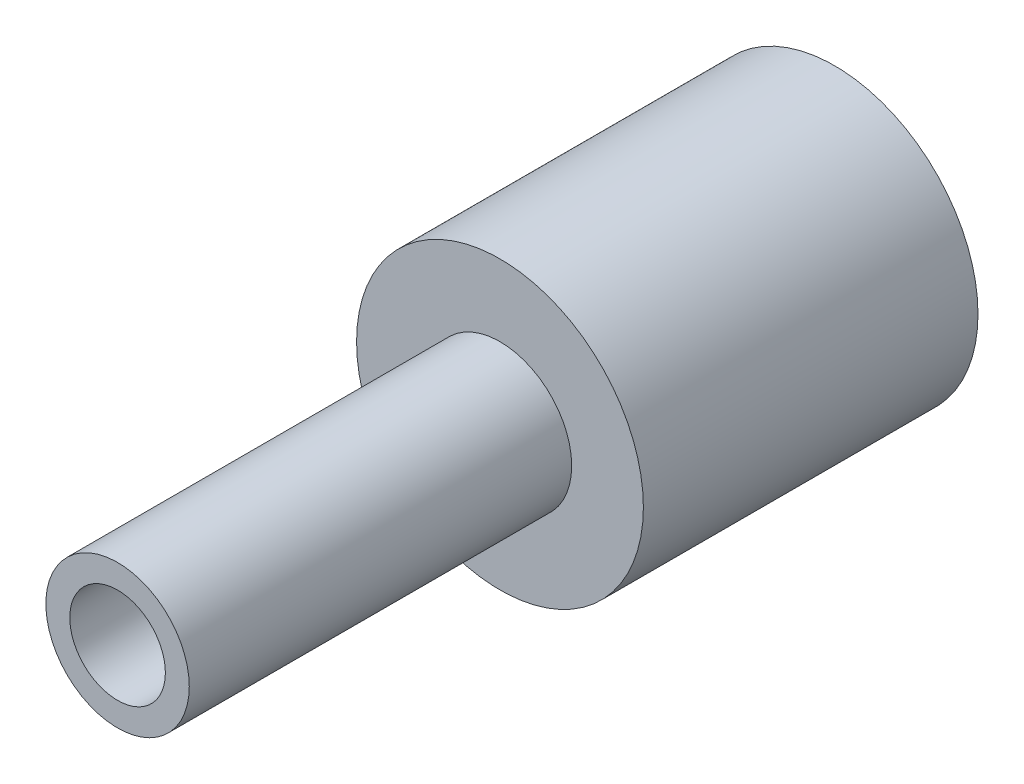
ISO-10303-21;
HEADER;
FILE_DESCRIPTION(('STEP AP214'),'2;1');
FILE_NAME('part.step','',(''),(''),'','','');
FILE_SCHEMA(('AUTOMOTIVE_DESIGN { 1 0 10303 214 1 1 1 1 }'));
ENDSEC;
DATA;
#1=APPLICATION_CONTEXT('core data for automotive mechanical design processes');
#2=APPLICATION_PROTOCOL_DEFINITION('international standard','automotive_design',2000,#1);
#3=PRODUCT_CONTEXT('',#1,'mechanical');
#4=PRODUCT('Part','Part','',(#3));
#5=PRODUCT_RELATED_PRODUCT_CATEGORY('part','',(#4));
#6=PRODUCT_DEFINITION_FORMATION('','',#4);
#7=PRODUCT_DEFINITION_CONTEXT('part definition',#1,'design');
#8=PRODUCT_DEFINITION('design','',#6,#7);
#9=PRODUCT_DEFINITION_SHAPE('','',#8);
#10=(LENGTH_UNIT() NAMED_UNIT(*) SI_UNIT(.MILLI.,.METRE.));
#11=(NAMED_UNIT(*) PLANE_ANGLE_UNIT() SI_UNIT($,.RADIAN.));
#12=(NAMED_UNIT(*) SI_UNIT($,.STERADIAN.) SOLID_ANGLE_UNIT());
#13=UNCERTAINTY_MEASURE_WITH_UNIT(LENGTH_MEASURE(1.E-05),#10,'distance_accuracy_value','');
#14=(GEOMETRIC_REPRESENTATION_CONTEXT(3) GLOBAL_UNCERTAINTY_ASSIGNED_CONTEXT((#13)) GLOBAL_UNIT_ASSIGNED_CONTEXT((#10,
#11,#12)) REPRESENTATION_CONTEXT('',''));
#15=CARTESIAN_POINT('',(0.,0.,0.));
#16=DIRECTION('',(0.,0.,1.));
#17=DIRECTION('',(1.,0.,0.));
#18=AXIS2_PLACEMENT_3D('',#15,#16,#17);
#19=CARTESIAN_POINT('',(0.,0.,88.9));
#20=DIRECTION('',(0.,0.,-1.));
#21=DIRECTION('',(-1.,0.,0.));
#22=AXIS2_PLACEMENT_3D('',#19,#20,#21);
#23=CYLINDRICAL_SURFACE('',#22,38.1);
#24=CARTESIAN_POINT('',(0.,0.,88.9));
#25=DIRECTION('',(0.,0.,1.));
#26=DIRECTION('',(1.,0.,0.));
#27=AXIS2_PLACEMENT_3D('',#24,#25,#26);
#28=CIRCLE('',#27,38.1);
#29=CARTESIAN_POINT('',(38.1,0.,88.9));
#30=VERTEX_POINT('',#29);
#31=EDGE_CURVE('E38',#30,#30,#28,.T.);
#32=ORIENTED_EDGE('',*,*,#31,.F.);
#33=EDGE_LOOP('',(#32));
#34=FACE_BOUND('',#33,.T.);
#35=CARTESIAN_POINT('',(0.,0.,0.));
#36=DIRECTION('',(0.,0.,1.));
#37=DIRECTION('',(1.,0.,0.));
#38=AXIS2_PLACEMENT_3D('',#35,#36,#37);
#39=CIRCLE('',#38,38.1);
#40=CARTESIAN_POINT('',(38.1,0.,0.));
#41=VERTEX_POINT('',#40);
#42=EDGE_CURVE('E34',#41,#41,#39,.T.);
#43=ORIENTED_EDGE('',*,*,#42,.T.);
#44=EDGE_LOOP('',(#43));
#45=FACE_BOUND('',#44,.T.);
#46=ADVANCED_FACE('F31',(#34,#45),#23,.T.);
#47=CARTESIAN_POINT('',(0.,0.,88.9));
#48=DIRECTION('',(0.,0.,1.));
#49=DIRECTION('',(1.,0.,0.));
#50=AXIS2_PLACEMENT_3D('',#47,#48,#49);
#51=PLANE('',#50);
#52=CARTESIAN_POINT('',(0.,0.,88.9));
#53=DIRECTION('',(0.,0.,1.));
#54=DIRECTION('',(1.,0.,0.));
#55=AXIS2_PLACEMENT_3D('',#52,#53,#54);
#56=CIRCLE('',#55,19.05);
#57=CARTESIAN_POINT('',(19.05,0.,88.9));
#58=VERTEX_POINT('',#57);
#59=EDGE_CURVE('E10',#58,#58,#56,.T.);
#60=ORIENTED_EDGE('',*,*,#59,.F.);
#61=EDGE_LOOP('',(#60));
#62=FACE_BOUND('',#61,.T.);
#63=ORIENTED_EDGE('',*,*,#31,.T.);
#64=EDGE_LOOP('',(#63));
#65=FACE_BOUND('',#64,.T.);
#66=ADVANCED_FACE('F70',(#62,#65),#51,.T.);
#67=CARTESIAN_POINT('',(0.,0.,0.));
#68=DIRECTION('',(0.,0.,1.));
#69=DIRECTION('',(1.,0.,0.));
#70=AXIS2_PLACEMENT_3D('',#67,#68,#69);
#71=PLANE('',#70);
#72=CARTESIAN_POINT('',(0.,0.,0.));
#73=DIRECTION('',(0.,0.,1.));
#74=DIRECTION('',(1.,0.,0.));
#75=AXIS2_PLACEMENT_3D('',#72,#73,#74);
#76=CIRCLE('',#75,12.7);
#77=CARTESIAN_POINT('',(12.7,0.,0.));
#78=VERTEX_POINT('',#77);
#79=EDGE_CURVE('E47',#78,#78,#76,.T.);
#80=ORIENTED_EDGE('',*,*,#79,.T.);
#81=EDGE_LOOP('',(#80));
#82=FACE_BOUND('',#81,.T.);
#83=ORIENTED_EDGE('',*,*,#42,.F.);
#84=EDGE_LOOP('',(#83));
#85=FACE_BOUND('',#84,.T.);
#86=ADVANCED_FACE('F65',(#82,#85),#71,.F.);
#87=CARTESIAN_POINT('',(0.,0.,190.5));
#88=DIRECTION('',(0.,0.,-1.));
#89=DIRECTION('',(-1.,0.,0.));
#90=AXIS2_PLACEMENT_3D('',#87,#88,#89);
#91=CYLINDRICAL_SURFACE('',#90,19.05);
#92=CARTESIAN_POINT('',(0.,0.,190.5));
#93=DIRECTION('',(0.,0.,1.));
#94=DIRECTION('',(1.,0.,0.));
#95=AXIS2_PLACEMENT_3D('',#92,#93,#94);
#96=CIRCLE('',#95,19.05);
#97=CARTESIAN_POINT('',(19.05,0.,190.5));
#98=VERTEX_POINT('',#97);
#99=EDGE_CURVE('E44',#98,#98,#96,.T.);
#100=ORIENTED_EDGE('',*,*,#99,.F.);
#101=EDGE_LOOP('',(#100));
#102=FACE_BOUND('',#101,.T.);
#103=ORIENTED_EDGE('',*,*,#59,.T.);
#104=EDGE_LOOP('',(#103));
#105=FACE_BOUND('',#104,.T.);
#106=ADVANCED_FACE('F60',(#102,#105),#91,.T.);
#107=CARTESIAN_POINT('',(0.,0.,190.5));
#108=DIRECTION('',(0.,0.,1.));
#109=DIRECTION('',(1.,0.,0.));
#110=AXIS2_PLACEMENT_3D('',#107,#108,#109);
#111=PLANE('',#110);
#112=CARTESIAN_POINT('',(0.,0.,190.5));
#113=DIRECTION('',(0.,0.,1.));
#114=DIRECTION('',(1.,0.,0.));
#115=AXIS2_PLACEMENT_3D('',#112,#113,#114);
#116=CIRCLE('',#115,12.7);
#117=CARTESIAN_POINT('',(12.7,0.,190.5));
#118=VERTEX_POINT('',#117);
#119=EDGE_CURVE('E50',#118,#118,#116,.T.);
#120=ORIENTED_EDGE('',*,*,#119,.F.);
#121=EDGE_LOOP('',(#120));
#122=FACE_BOUND('',#121,.T.);
#123=ORIENTED_EDGE('',*,*,#99,.T.);
#124=EDGE_LOOP('',(#123));
#125=FACE_BOUND('',#124,.T.);
#126=ADVANCED_FACE('F57',(#122,#125),#111,.T.);
#127=CARTESIAN_POINT('',(0.,0.,-12.192));
#128=DIRECTION('',(0.,0.,1.));
#129=DIRECTION('',(1.,0.,0.));
#130=AXIS2_PLACEMENT_3D('',#127,#128,#129);
#131=CYLINDRICAL_SURFACE('',#130,12.7);
#132=ORIENTED_EDGE('',*,*,#119,.T.);
#133=EDGE_LOOP('',(#132));
#134=FACE_BOUND('',#133,.T.);
#135=ORIENTED_EDGE('',*,*,#79,.F.);
#136=EDGE_LOOP('',(#135));
#137=FACE_BOUND('',#136,.T.);
#138=ADVANCED_FACE('F54',(#134,#137),#131,.F.);
#139=CLOSED_SHELL('',(#46,#66,#86,#106,#126,#138));
#140=MANIFOLD_SOLID_BREP('B2',#139);
#141=ADVANCED_BREP_SHAPE_REPRESENTATION('',(#18,#140),#14);
#142=SHAPE_DEFINITION_REPRESENTATION(#9,#141);
ENDSEC;
END-ISO-10303-21;
